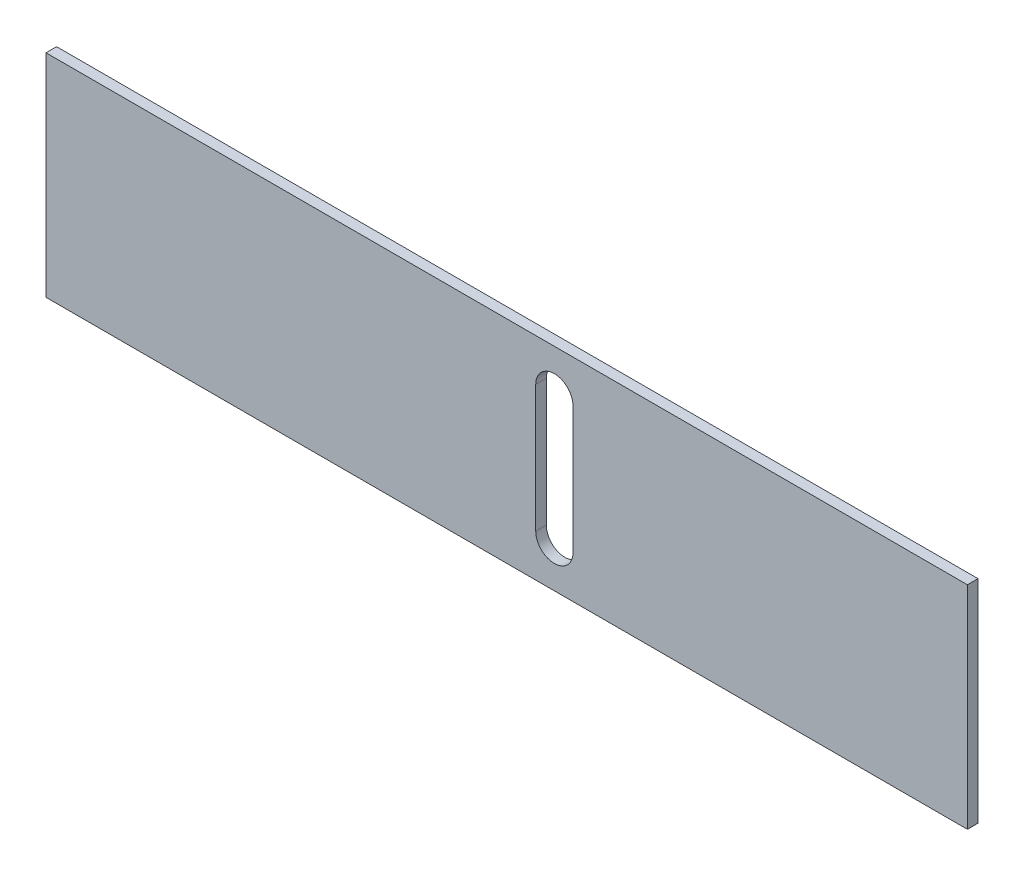
ISO-10303-21;
HEADER;
FILE_DESCRIPTION(('STEP AP214'),'2;1');
FILE_NAME('part.step','',(''),(''),'','','');
FILE_SCHEMA(('AUTOMOTIVE_DESIGN { 1 0 10303 214 1 1 1 1 }'));
ENDSEC;
DATA;
#1=APPLICATION_CONTEXT('core data for automotive mechanical design processes');
#2=APPLICATION_PROTOCOL_DEFINITION('international standard','automotive_design',2000,#1);
#3=PRODUCT_CONTEXT('',#1,'mechanical');
#4=PRODUCT('Part','Part','',(#3));
#5=PRODUCT_RELATED_PRODUCT_CATEGORY('part','',(#4));
#6=PRODUCT_DEFINITION_FORMATION('','',#4);
#7=PRODUCT_DEFINITION_CONTEXT('part definition',#1,'design');
#8=PRODUCT_DEFINITION('design','',#6,#7);
#9=PRODUCT_DEFINITION_SHAPE('','',#8);
#10=(LENGTH_UNIT() NAMED_UNIT(*) SI_UNIT(.MILLI.,.METRE.));
#11=(NAMED_UNIT(*) PLANE_ANGLE_UNIT() SI_UNIT($,.RADIAN.));
#12=(NAMED_UNIT(*) SI_UNIT($,.STERADIAN.) SOLID_ANGLE_UNIT());
#13=UNCERTAINTY_MEASURE_WITH_UNIT(LENGTH_MEASURE(1.E-05),#10,'distance_accuracy_value','');
#14=(GEOMETRIC_REPRESENTATION_CONTEXT(3) GLOBAL_UNCERTAINTY_ASSIGNED_CONTEXT((#13)) GLOBAL_UNIT_ASSIGNED_CONTEXT((#10,
#11,#12)) REPRESENTATION_CONTEXT('',''));
#15=CARTESIAN_POINT('',(0.,0.,0.));
#16=DIRECTION('',(0.,0.,1.));
#17=DIRECTION('',(1.,0.,0.));
#18=AXIS2_PLACEMENT_3D('',#15,#16,#17);
#19=CARTESIAN_POINT('',(304.8,25.4,0.));
#20=DIRECTION('',(0.,0.,-1.));
#21=DIRECTION('',(0.,-1.,0.));
#22=AXIS2_PLACEMENT_3D('',#19,#20,#21);
#23=CYLINDRICAL_SURFACE('',#22,11.176);
#24=CARTESIAN_POINT('',(304.8,25.4,-6.35));
#25=DIRECTION('',(0.,0.,1.));
#26=DIRECTION('',(1.,0.,0.));
#27=AXIS2_PLACEMENT_3D('',#24,#25,#26);
#28=CIRCLE('',#27,11.176);
#29=CARTESIAN_POINT('',(293.624,25.4,-6.35));
#30=VERTEX_POINT('',#29);
#31=CARTESIAN_POINT('',(315.976,25.4,-6.35));
#32=VERTEX_POINT('',#31);
#33=EDGE_CURVE('E33',#30,#32,#28,.T.);
#34=ORIENTED_EDGE('',*,*,#33,.F.);
#35=DIRECTION('',(0.,0.,-1.));
#36=VECTOR('',#35,1.);
#37=CARTESIAN_POINT('',(293.624,25.4,0.));
#38=LINE('',#37,#36);
#39=CARTESIAN_POINT('',(293.624,25.4,0.));
#40=VERTEX_POINT('',#39);
#41=EDGE_CURVE('E113',#40,#30,#38,.T.);
#42=ORIENTED_EDGE('',*,*,#41,.F.);
#43=CARTESIAN_POINT('',(304.8,25.4,0.));
#44=DIRECTION('',(0.,0.,-1.));
#45=DIRECTION('',(0.,-1.,0.));
#46=AXIS2_PLACEMENT_3D('',#43,#44,#45);
#47=CIRCLE('',#46,11.176);
#48=CARTESIAN_POINT('',(315.976,25.4,0.));
#49=VERTEX_POINT('',#48);
#50=EDGE_CURVE('E175',#49,#40,#47,.T.);
#51=ORIENTED_EDGE('',*,*,#50,.F.);
#52=DIRECTION('',(0.,0.,-1.));
#53=VECTOR('',#52,1.);
#54=CARTESIAN_POINT('',(315.976,25.4,0.));
#55=LINE('',#54,#53);
#56=EDGE_CURVE('E10',#49,#32,#55,.T.);
#57=ORIENTED_EDGE('',*,*,#56,.T.);
#58=EDGE_LOOP('',(#34,#42,#51,#57));
#59=FACE_BOUND('',#58,.T.);
#60=ADVANCED_FACE('F16',(#59),#23,.F.);
#61=CARTESIAN_POINT('',(315.976,101.6,0.));
#62=DIRECTION('',(1.,0.,0.));
#63=DIRECTION('',(0.,0.,-1.));
#64=AXIS2_PLACEMENT_3D('',#61,#62,#63);
#65=PLANE('',#64);
#66=DIRECTION('',(0.,1.,0.));
#67=VECTOR('',#66,1.);
#68=CARTESIAN_POINT('',(315.976,25.4,-6.35));
#69=LINE('',#68,#67);
#70=CARTESIAN_POINT('',(315.976,101.6,-6.35));
#71=VERTEX_POINT('',#70);
#72=EDGE_CURVE('E127',#32,#71,#69,.T.);
#73=ORIENTED_EDGE('',*,*,#72,.F.);
#74=ORIENTED_EDGE('',*,*,#56,.F.);
#75=DIRECTION('',(0.,-1.,0.));
#76=VECTOR('',#75,1.);
#77=CARTESIAN_POINT('',(315.976,101.6,0.));
#78=LINE('',#77,#76);
#79=CARTESIAN_POINT('',(315.976,101.6,0.));
#80=VERTEX_POINT('',#79);
#81=EDGE_CURVE('E177',#80,#49,#78,.T.);
#82=ORIENTED_EDGE('',*,*,#81,.F.);
#83=DIRECTION('',(0.,0.,-1.));
#84=VECTOR('',#83,1.);
#85=CARTESIAN_POINT('',(315.976,101.6,0.));
#86=LINE('',#85,#84);
#87=EDGE_CURVE('E25',#80,#71,#86,.T.);
#88=ORIENTED_EDGE('',*,*,#87,.T.);
#89=EDGE_LOOP('',(#73,#74,#82,#88));
#90=FACE_BOUND('',#89,.T.);
#91=ADVANCED_FACE('F145',(#90),#65,.F.);
#92=CARTESIAN_POINT('',(304.8,101.6,0.));
#93=DIRECTION('',(0.,0.,-1.));
#94=DIRECTION('',(0.,-1.,0.));
#95=AXIS2_PLACEMENT_3D('',#92,#93,#94);
#96=CYLINDRICAL_SURFACE('',#95,11.176);
#97=CARTESIAN_POINT('',(304.8,101.6,-6.35));
#98=DIRECTION('',(0.,0.,1.));
#99=DIRECTION('',(1.,0.,0.));
#100=AXIS2_PLACEMENT_3D('',#97,#98,#99);
#101=CIRCLE('',#100,11.176);
#102=CARTESIAN_POINT('',(293.624,101.6,-6.35));
#103=VERTEX_POINT('',#102);
#104=EDGE_CURVE('E108',#71,#103,#101,.T.);
#105=ORIENTED_EDGE('',*,*,#104,.F.);
#106=ORIENTED_EDGE('',*,*,#87,.F.);
#107=CARTESIAN_POINT('',(304.8,101.6,0.));
#108=DIRECTION('',(0.,0.,-1.));
#109=DIRECTION('',(0.,-1.,0.));
#110=AXIS2_PLACEMENT_3D('',#107,#108,#109);
#111=CIRCLE('',#110,11.176);
#112=CARTESIAN_POINT('',(293.624,101.6,0.));
#113=VERTEX_POINT('',#112);
#114=EDGE_CURVE('E126',#113,#80,#111,.T.);
#115=ORIENTED_EDGE('',*,*,#114,.F.);
#116=DIRECTION('',(0.,0.,-1.));
#117=VECTOR('',#116,1.);
#118=CARTESIAN_POINT('',(293.624,101.6,0.));
#119=LINE('',#118,#117);
#120=EDGE_CURVE('E116',#113,#103,#119,.T.);
#121=ORIENTED_EDGE('',*,*,#120,.T.);
#122=EDGE_LOOP('',(#105,#106,#115,#121));
#123=FACE_BOUND('',#122,.T.);
#124=ADVANCED_FACE('F149',(#123),#96,.F.);
#125=CARTESIAN_POINT('',(293.624,25.4,0.));
#126=DIRECTION('',(-1.,0.,0.));
#127=DIRECTION('',(0.,0.,1.));
#128=AXIS2_PLACEMENT_3D('',#125,#126,#127);
#129=PLANE('',#128);
#130=DIRECTION('',(0.,-1.,0.));
#131=VECTOR('',#130,1.);
#132=CARTESIAN_POINT('',(293.624,101.6,-6.35));
#133=LINE('',#132,#131);
#134=EDGE_CURVE('E165',#103,#30,#133,.T.);
#135=ORIENTED_EDGE('',*,*,#134,.F.);
#136=ORIENTED_EDGE('',*,*,#120,.F.);
#137=DIRECTION('',(0.,1.,0.));
#138=VECTOR('',#137,1.);
#139=CARTESIAN_POINT('',(293.624,25.4,0.));
#140=LINE('',#139,#138);
#141=EDGE_CURVE('E174',#40,#113,#140,.T.);
#142=ORIENTED_EDGE('',*,*,#141,.F.);
#143=ORIENTED_EDGE('',*,*,#41,.T.);
#144=EDGE_LOOP('',(#135,#136,#142,#143));
#145=FACE_BOUND('',#144,.T.);
#146=ADVANCED_FACE('F142',(#145),#129,.F.);
#147=CARTESIAN_POINT('',(552.45,127.,0.));
#148=DIRECTION('',(1.,0.,0.));
#149=DIRECTION('',(0.,0.,-1.));
#150=AXIS2_PLACEMENT_3D('',#147,#148,#149);
#151=PLANE('',#150);
#152=DIRECTION('',(0.,1.,0.));
#153=VECTOR('',#152,1.);
#154=CARTESIAN_POINT('',(552.45,0.,0.));
#155=LINE('',#154,#153);
#156=CARTESIAN_POINT('',(552.45,0.,0.));
#157=VERTEX_POINT('',#156);
#158=CARTESIAN_POINT('',(552.45,127.,0.));
#159=VERTEX_POINT('',#158);
#160=EDGE_CURVE('E112',#157,#159,#155,.T.);
#161=ORIENTED_EDGE('',*,*,#160,.F.);
#162=DIRECTION('',(0.,0.,-1.));
#163=VECTOR('',#162,1.);
#164=CARTESIAN_POINT('',(552.45,0.,0.));
#165=LINE('',#164,#163);
#166=CARTESIAN_POINT('',(552.45,0.,-6.35));
#167=VERTEX_POINT('',#166);
#168=EDGE_CURVE('E110',#157,#167,#165,.T.);
#169=ORIENTED_EDGE('',*,*,#168,.T.);
#170=DIRECTION('',(0.,-1.,0.));
#171=VECTOR('',#170,1.);
#172=CARTESIAN_POINT('',(552.45,127.,-6.35));
#173=LINE('',#172,#171);
#174=CARTESIAN_POINT('',(552.45,127.,-6.35));
#175=VERTEX_POINT('',#174);
#176=EDGE_CURVE('E103',#175,#167,#173,.T.);
#177=ORIENTED_EDGE('',*,*,#176,.F.);
#178=DIRECTION('',(0.,0.,-1.));
#179=VECTOR('',#178,1.);
#180=CARTESIAN_POINT('',(552.45,127.,0.));
#181=LINE('',#180,#179);
#182=EDGE_CURVE('E114',#159,#175,#181,.T.);
#183=ORIENTED_EDGE('',*,*,#182,.F.);
#184=EDGE_LOOP('',(#161,#169,#177,#183));
#185=FACE_BOUND('',#184,.T.);
#186=ADVANCED_FACE('F111',(#185),#151,.T.);
#187=CARTESIAN_POINT('',(0.,127.,0.));
#188=DIRECTION('',(0.,1.,0.));
#189=DIRECTION('',(0.,0.,1.));
#190=AXIS2_PLACEMENT_3D('',#187,#188,#189);
#191=PLANE('',#190);
#192=DIRECTION('',(-1.,0.,0.));
#193=VECTOR('',#192,1.);
#194=CARTESIAN_POINT('',(552.45,127.,0.));
#195=LINE('',#194,#193);
#196=CARTESIAN_POINT('',(0.,127.,0.));
#197=VERTEX_POINT('',#196);
#198=EDGE_CURVE('E122',#159,#197,#195,.T.);
#199=ORIENTED_EDGE('',*,*,#198,.F.);
#200=ORIENTED_EDGE('',*,*,#182,.T.);
#201=DIRECTION('',(1.,0.,0.));
#202=VECTOR('',#201,1.);
#203=CARTESIAN_POINT('',(0.,127.,-6.35));
#204=LINE('',#203,#202);
#205=CARTESIAN_POINT('',(0.,127.,-6.35));
#206=VERTEX_POINT('',#205);
#207=EDGE_CURVE('E93',#206,#175,#204,.T.);
#208=ORIENTED_EDGE('',*,*,#207,.F.);
#209=DIRECTION('',(0.,0.,-1.));
#210=VECTOR('',#209,1.);
#211=CARTESIAN_POINT('',(0.,127.,0.));
#212=LINE('',#211,#210);
#213=EDGE_CURVE('E89',#197,#206,#212,.T.);
#214=ORIENTED_EDGE('',*,*,#213,.F.);
#215=EDGE_LOOP('',(#199,#200,#208,#214));
#216=FACE_BOUND('',#215,.T.);
#217=ADVANCED_FACE('F133',(#216),#191,.T.);
#218=CARTESIAN_POINT('',(0.,0.,0.));
#219=DIRECTION('',(-1.,0.,0.));
#220=DIRECTION('',(0.,0.,1.));
#221=AXIS2_PLACEMENT_3D('',#218,#219,#220);
#222=PLANE('',#221);
#223=DIRECTION('',(0.,-1.,0.));
#224=VECTOR('',#223,1.);
#225=CARTESIAN_POINT('',(0.,127.,0.));
#226=LINE('',#225,#224);
#227=CARTESIAN_POINT('',(0.,0.,0.));
#228=VERTEX_POINT('',#227);
#229=EDGE_CURVE('E77',#197,#228,#226,.T.);
#230=ORIENTED_EDGE('',*,*,#229,.F.);
#231=ORIENTED_EDGE('',*,*,#213,.T.);
#232=DIRECTION('',(0.,1.,0.));
#233=VECTOR('',#232,1.);
#234=CARTESIAN_POINT('',(0.,0.,-6.35));
#235=LINE('',#234,#233);
#236=CARTESIAN_POINT('',(0.,0.,-6.35));
#237=VERTEX_POINT('',#236);
#238=EDGE_CURVE('E83',#237,#206,#235,.T.);
#239=ORIENTED_EDGE('',*,*,#238,.F.);
#240=DIRECTION('',(0.,0.,-1.));
#241=VECTOR('',#240,1.);
#242=CARTESIAN_POINT('',(0.,0.,0.));
#243=LINE('',#242,#241);
#244=EDGE_CURVE('E86',#228,#237,#243,.T.);
#245=ORIENTED_EDGE('',*,*,#244,.F.);
#246=EDGE_LOOP('',(#230,#231,#239,#245));
#247=FACE_BOUND('',#246,.T.);
#248=ADVANCED_FACE('F85',(#247),#222,.T.);
#249=CARTESIAN_POINT('',(552.45,0.,0.));
#250=DIRECTION('',(0.,-1.,0.));
#251=DIRECTION('',(0.,0.,-1.));
#252=AXIS2_PLACEMENT_3D('',#249,#250,#251);
#253=PLANE('',#252);
#254=DIRECTION('',(1.,0.,0.));
#255=VECTOR('',#254,1.);
#256=CARTESIAN_POINT('',(0.,0.,0.));
#257=LINE('',#256,#255);
#258=EDGE_CURVE('E99',#228,#157,#257,.T.);
#259=ORIENTED_EDGE('',*,*,#258,.F.);
#260=ORIENTED_EDGE('',*,*,#244,.T.);
#261=DIRECTION('',(-1.,0.,0.));
#262=VECTOR('',#261,1.);
#263=CARTESIAN_POINT('',(552.45,0.,-6.35));
#264=LINE('',#263,#262);
#265=EDGE_CURVE('E19',#167,#237,#264,.T.);
#266=ORIENTED_EDGE('',*,*,#265,.F.);
#267=ORIENTED_EDGE('',*,*,#168,.F.);
#268=EDGE_LOOP('',(#259,#260,#266,#267));
#269=FACE_BOUND('',#268,.T.);
#270=ADVANCED_FACE('F97',(#269),#253,.T.);
#271=CARTESIAN_POINT('',(276.225,63.5,-6.35));
#272=DIRECTION('',(0.,0.,1.));
#273=DIRECTION('',(1.,0.,0.));
#274=AXIS2_PLACEMENT_3D('',#271,#272,#273);
#275=PLANE('',#274);
#276=ORIENTED_EDGE('',*,*,#265,.T.);
#277=ORIENTED_EDGE('',*,*,#238,.T.);
#278=ORIENTED_EDGE('',*,*,#207,.T.);
#279=ORIENTED_EDGE('',*,*,#176,.T.);
#280=EDGE_LOOP('',(#276,#277,#278,#279));
#281=FACE_BOUND('',#280,.T.);
#282=ORIENTED_EDGE('',*,*,#104,.T.);
#283=ORIENTED_EDGE('',*,*,#134,.T.);
#284=ORIENTED_EDGE('',*,*,#33,.T.);
#285=ORIENTED_EDGE('',*,*,#72,.T.);
#286=EDGE_LOOP('',(#282,#283,#284,#285));
#287=FACE_BOUND('',#286,.T.);
#288=ADVANCED_FACE('F101',(#281,#287),#275,.F.);
#289=CARTESIAN_POINT('',(276.225,63.5,0.));
#290=DIRECTION('',(0.,0.,1.));
#291=DIRECTION('',(1.,0.,0.));
#292=AXIS2_PLACEMENT_3D('',#289,#290,#291);
#293=PLANE('',#292);
#294=ORIENTED_EDGE('',*,*,#258,.T.);
#295=ORIENTED_EDGE('',*,*,#160,.T.);
#296=ORIENTED_EDGE('',*,*,#198,.T.);
#297=ORIENTED_EDGE('',*,*,#229,.T.);
#298=EDGE_LOOP('',(#294,#295,#296,#297));
#299=FACE_BOUND('',#298,.T.);
#300=ORIENTED_EDGE('',*,*,#114,.T.);
#301=ORIENTED_EDGE('',*,*,#81,.T.);
#302=ORIENTED_EDGE('',*,*,#50,.T.);
#303=ORIENTED_EDGE('',*,*,#141,.T.);
#304=EDGE_LOOP('',(#300,#301,#302,#303));
#305=FACE_BOUND('',#304,.T.);
#306=ADVANCED_FACE('F129',(#299,#305),#293,.T.);
#307=CLOSED_SHELL('',(#60,#91,#124,#146,#186,#217,#248,#270,#288,#306));
#308=MANIFOLD_SOLID_BREP('B1',#307);
#309=ADVANCED_BREP_SHAPE_REPRESENTATION('',(#18,#308),#14);
#310=SHAPE_DEFINITION_REPRESENTATION(#9,#309);
ENDSEC;
END-ISO-10303-21;
